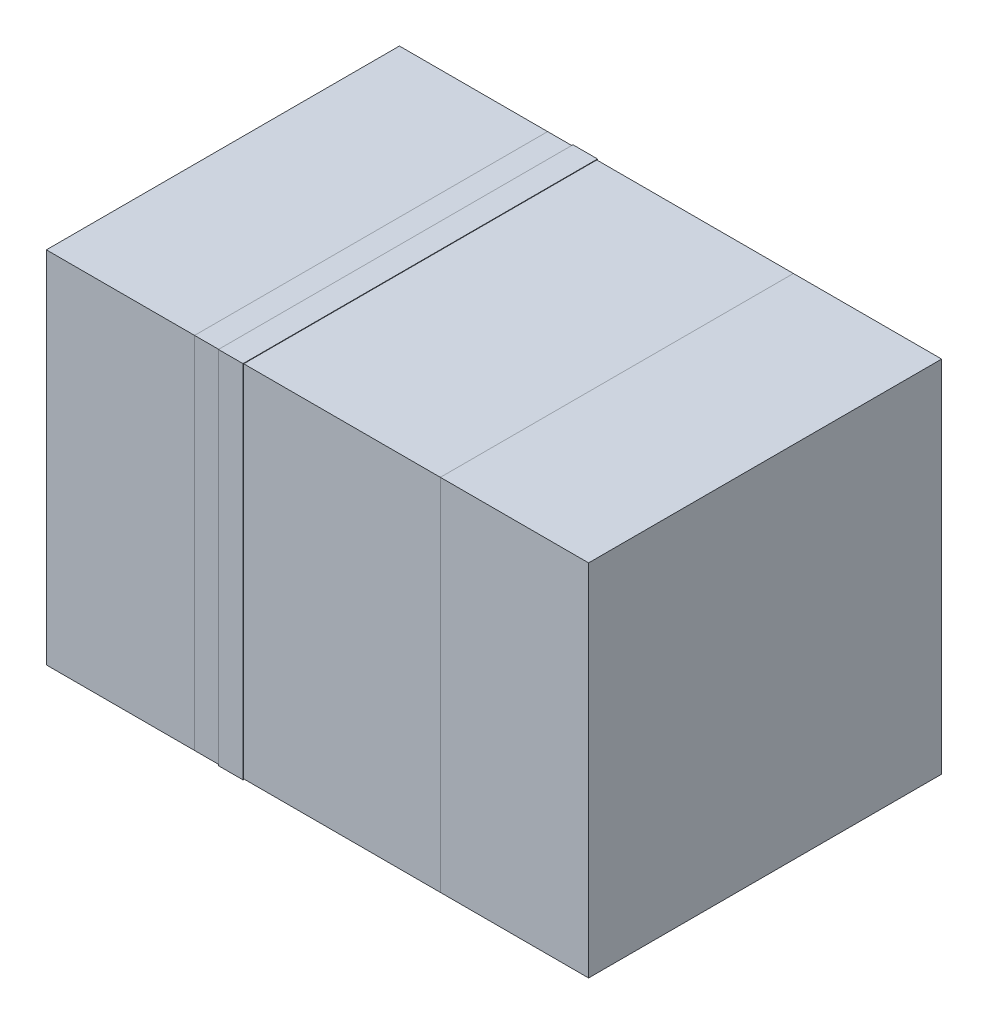
ISO-10303-21;
HEADER;
FILE_DESCRIPTION(('STEP AP214'),'2;1');
FILE_NAME('part.step','',(''),(''),'','','');
FILE_SCHEMA(('AUTOMOTIVE_DESIGN { 1 0 10303 214 1 1 1 1 }'));
ENDSEC;
DATA;
#1=APPLICATION_CONTEXT('core data for automotive mechanical design processes');
#2=APPLICATION_PROTOCOL_DEFINITION('international standard','automotive_design',2000,#1);
#3=PRODUCT_CONTEXT('',#1,'mechanical');
#4=PRODUCT('Part','Part','',(#3));
#5=PRODUCT_RELATED_PRODUCT_CATEGORY('part','',(#4));
#6=PRODUCT_DEFINITION_FORMATION('','',#4);
#7=PRODUCT_DEFINITION_CONTEXT('part definition',#1,'design');
#8=PRODUCT_DEFINITION('design','',#6,#7);
#9=PRODUCT_DEFINITION_SHAPE('','',#8);
#10=(LENGTH_UNIT() NAMED_UNIT(*) SI_UNIT(.MILLI.,.METRE.));
#11=(NAMED_UNIT(*) PLANE_ANGLE_UNIT() SI_UNIT($,.RADIAN.));
#12=(NAMED_UNIT(*) SI_UNIT($,.STERADIAN.) SOLID_ANGLE_UNIT());
#13=UNCERTAINTY_MEASURE_WITH_UNIT(LENGTH_MEASURE(1.E-05),#10,'distance_accuracy_value','');
#14=(GEOMETRIC_REPRESENTATION_CONTEXT(3) GLOBAL_UNCERTAINTY_ASSIGNED_CONTEXT((#13)) GLOBAL_UNIT_ASSIGNED_CONTEXT((#10,
#11,#12)) REPRESENTATION_CONTEXT('',''));
#15=CARTESIAN_POINT('',(0.,0.,0.));
#16=DIRECTION('',(0.,0.,1.));
#17=DIRECTION('',(1.,0.,0.));
#18=AXIS2_PLACEMENT_3D('',#15,#16,#17);
#19=CARTESIAN_POINT('',(-1.092,0.724,0.));
#20=DIRECTION('',(-1.,0.,0.));
#21=DIRECTION('',(0.,0.,1.));
#22=AXIS2_PLACEMENT_3D('',#19,#20,#21);
#23=PLANE('',#22);
#24=DIRECTION('',(0.,1.,0.));
#25=VECTOR('',#24,1.);
#26=CARTESIAN_POINT('',(-1.092,-0.724,1.422));
#27=LINE('',#26,#25);
#28=CARTESIAN_POINT('',(-1.092,0.724,1.422));
#29=VERTEX_POINT('',#28);
#30=CARTESIAN_POINT('',(-1.092,-0.724,1.422));
#31=VERTEX_POINT('',#30);
#32=EDGE_CURVE('P0_E67',#29,#31,#27,.F.);
#33=ORIENTED_EDGE('',*,*,#32,.F.);
#34=DIRECTION('',(0.,0.,1.));
#35=VECTOR('',#34,1.);
#36=CARTESIAN_POINT('',(-1.092,0.724,0.));
#37=LINE('',#36,#35);
#38=CARTESIAN_POINT('',(-1.092,0.724,0.));
#39=VERTEX_POINT('',#38);
#40=EDGE_CURVE('P0_E54',#39,#29,#37,.T.);
#41=ORIENTED_EDGE('',*,*,#40,.F.);
#42=DIRECTION('',(0.,1.,0.));
#43=VECTOR('',#42,1.);
#44=CARTESIAN_POINT('',(-1.092,0.724,0.));
#45=LINE('',#44,#43);
#46=CARTESIAN_POINT('',(-1.092,-0.724,0.));
#47=VERTEX_POINT('',#46);
#48=EDGE_CURVE('P0_E19',#47,#39,#45,.T.);
#49=ORIENTED_EDGE('',*,*,#48,.F.);
#50=DIRECTION('',(0.,0.,-1.));
#51=VECTOR('',#50,1.);
#52=CARTESIAN_POINT('',(-1.092,-0.724,0.));
#53=LINE('',#52,#51);
#54=EDGE_CURVE('P0_E80',#31,#47,#53,.T.);
#55=ORIENTED_EDGE('',*,*,#54,.F.);
#56=EDGE_LOOP('',(#33,#41,#49,#55));
#57=FACE_BOUND('',#56,.T.);
#58=ADVANCED_FACE('P0_F16',(#57),#23,.T.);
#59=CARTESIAN_POINT('',(-1.092,0.724,0.));
#60=DIRECTION('',(0.,0.,-1.));
#61=DIRECTION('',(-1.,0.,0.));
#62=AXIS2_PLACEMENT_3D('',#59,#60,#61);
#63=PLANE('',#62);
#64=DIRECTION('',(1.,0.,0.));
#65=VECTOR('',#64,1.);
#66=CARTESIAN_POINT('',(-1.092,-0.724,0.));
#67=LINE('',#66,#65);
#68=CARTESIAN_POINT('',(-0.495,-0.724,0.));
#69=VERTEX_POINT('',#68);
#70=EDGE_CURVE('P0_E63',#47,#69,#67,.T.);
#71=ORIENTED_EDGE('',*,*,#70,.F.);
#72=ORIENTED_EDGE('',*,*,#48,.T.);
#73=DIRECTION('',(1.,0.,0.));
#74=VECTOR('',#73,1.);
#75=CARTESIAN_POINT('',(-0.495,0.724,0.));
#76=LINE('',#75,#74);
#77=CARTESIAN_POINT('',(-0.495,0.724,0.));
#78=VERTEX_POINT('',#77);
#79=EDGE_CURVE('P0_E60',#78,#39,#76,.F.);
#80=ORIENTED_EDGE('',*,*,#79,.F.);
#81=DIRECTION('',(0.,1.,0.));
#82=VECTOR('',#81,1.);
#83=CARTESIAN_POINT('',(-0.495,-0.724,0.));
#84=LINE('',#83,#82);
#85=EDGE_CURVE('P0_E82',#69,#78,#84,.T.);
#86=ORIENTED_EDGE('',*,*,#85,.F.);
#87=EDGE_LOOP('',(#71,#72,#80,#86));
#88=FACE_BOUND('',#87,.T.);
#89=ADVANCED_FACE('P0_F59',(#88),#63,.T.);
#90=CARTESIAN_POINT('',(-0.495,0.724,0.));
#91=DIRECTION('',(0.,1.,0.));
#92=DIRECTION('',(0.,0.,1.));
#93=AXIS2_PLACEMENT_3D('',#90,#91,#92);
#94=PLANE('',#93);
#95=DIRECTION('',(1.,0.,0.));
#96=VECTOR('',#95,1.);
#97=CARTESIAN_POINT('',(-1.092,0.724,1.422));
#98=LINE('',#97,#96);
#99=CARTESIAN_POINT('',(-0.495,0.724,1.422));
#100=VERTEX_POINT('',#99);
#101=EDGE_CURVE('P0_E69',#100,#29,#98,.F.);
#102=ORIENTED_EDGE('',*,*,#101,.F.);
#103=DIRECTION('',(0.,0.,-1.));
#104=VECTOR('',#103,1.);
#105=CARTESIAN_POINT('',(-0.495,0.724,0.));
#106=LINE('',#105,#104);
#107=EDGE_CURVE('P0_E73',#78,#100,#106,.F.);
#108=ORIENTED_EDGE('',*,*,#107,.F.);
#109=ORIENTED_EDGE('',*,*,#79,.T.);
#110=ORIENTED_EDGE('',*,*,#40,.T.);
#111=EDGE_LOOP('',(#102,#108,#109,#110));
#112=FACE_BOUND('',#111,.T.);
#113=ADVANCED_FACE('P0_F71',(#112),#94,.T.);
#114=CARTESIAN_POINT('',(-1.092,-0.724,1.422));
#115=DIRECTION('',(0.,0.,1.));
#116=DIRECTION('',(1.,0.,0.));
#117=AXIS2_PLACEMENT_3D('',#114,#115,#116);
#118=PLANE('',#117);
#119=ORIENTED_EDGE('',*,*,#101,.T.);
#120=ORIENTED_EDGE('',*,*,#32,.T.);
#121=DIRECTION('',(1.,0.,0.));
#122=VECTOR('',#121,1.);
#123=CARTESIAN_POINT('',(-1.092,-0.724,1.422));
#124=LINE('',#123,#122);
#125=CARTESIAN_POINT('',(-0.495,-0.724,1.422));
#126=VERTEX_POINT('',#125);
#127=EDGE_CURVE('P0_E34',#126,#31,#124,.F.);
#128=ORIENTED_EDGE('',*,*,#127,.F.);
#129=DIRECTION('',(0.,1.,0.));
#130=VECTOR('',#129,1.);
#131=CARTESIAN_POINT('',(-0.495,-0.724,1.422));
#132=LINE('',#131,#130);
#133=EDGE_CURVE('P0_E25',#100,#126,#132,.F.);
#134=ORIENTED_EDGE('',*,*,#133,.F.);
#135=EDGE_LOOP('',(#119,#120,#128,#134));
#136=FACE_BOUND('',#135,.T.);
#137=ADVANCED_FACE('P0_F88',(#136),#118,.T.);
#138=CARTESIAN_POINT('',(-1.092,-0.724,0.));
#139=DIRECTION('',(0.,-1.,0.));
#140=DIRECTION('',(0.,0.,-1.));
#141=AXIS2_PLACEMENT_3D('',#138,#139,#140);
#142=PLANE('',#141);
#143=ORIENTED_EDGE('',*,*,#127,.T.);
#144=ORIENTED_EDGE('',*,*,#54,.T.);
#145=ORIENTED_EDGE('',*,*,#70,.T.);
#146=DIRECTION('',(0.,0.,-1.));
#147=VECTOR('',#146,1.);
#148=CARTESIAN_POINT('',(-0.495,-0.724,0.));
#149=LINE('',#148,#147);
#150=EDGE_CURVE('P0_E11',#126,#69,#149,.T.);
#151=ORIENTED_EDGE('',*,*,#150,.F.);
#152=EDGE_LOOP('',(#143,#144,#145,#151));
#153=FACE_BOUND('',#152,.T.);
#154=ADVANCED_FACE('P0_F90',(#153),#142,.T.);
#155=CARTESIAN_POINT('',(-0.495,-0.724,0.));
#156=DIRECTION('',(1.,0.,0.));
#157=DIRECTION('',(0.,0.,-1.));
#158=AXIS2_PLACEMENT_3D('',#155,#156,#157);
#159=PLANE('',#158);
#160=ORIENTED_EDGE('',*,*,#133,.T.);
#161=ORIENTED_EDGE('',*,*,#150,.T.);
#162=ORIENTED_EDGE('',*,*,#85,.T.);
#163=ORIENTED_EDGE('',*,*,#107,.T.);
#164=EDGE_LOOP('',(#160,#161,#162,#163));
#165=FACE_BOUND('',#164,.T.);
#166=ADVANCED_FACE('P0_F87',(#165),#159,.T.);
#167=CLOSED_SHELL('',(#58,#89,#113,#137,#154,#166));
#168=MANIFOLD_SOLID_BREP('P0_B1',#167);
#169=CARTESIAN_POINT('',(-0.396,-0.726,-0.003));
#170=DIRECTION('',(0.,-1.,0.));
#171=DIRECTION('',(0.,0.,-1.));
#172=AXIS2_PLACEMENT_3D('',#169,#170,#171);
#173=PLANE('',#172);
#174=DIRECTION('',(1.,0.,0.));
#175=VECTOR('',#174,1.);
#176=CARTESIAN_POINT('',(-0.396,-0.726,1.425));
#177=LINE('',#176,#175);
#178=CARTESIAN_POINT('',(-0.297,-0.726,1.425));
#179=VERTEX_POINT('',#178);
#180=CARTESIAN_POINT('',(-0.396,-0.726,1.425));
#181=VERTEX_POINT('',#180);
#182=EDGE_CURVE('P1_E95',#179,#181,#177,.F.);
#183=ORIENTED_EDGE('',*,*,#182,.T.);
#184=DIRECTION('',(0.,0.,1.));
#185=VECTOR('',#184,1.);
#186=CARTESIAN_POINT('',(-0.396,-0.726,0.));
#187=LINE('',#186,#185);
#188=CARTESIAN_POINT('',(-0.396,-0.726,-0.00299999999999999));
#189=VERTEX_POINT('',#188);
#190=EDGE_CURVE('P1_E94',#189,#181,#187,.T.);
#191=ORIENTED_EDGE('',*,*,#190,.F.);
#192=DIRECTION('',(1.,0.,0.));
#193=VECTOR('',#192,1.);
#194=CARTESIAN_POINT('',(-0.396,-0.726,-0.003));
#195=LINE('',#194,#193);
#196=CARTESIAN_POINT('',(-0.297,-0.726,-0.003));
#197=VERTEX_POINT('',#196);
#198=EDGE_CURVE('P1_E19',#189,#197,#195,.T.);
#199=ORIENTED_EDGE('',*,*,#198,.T.);
#200=DIRECTION('',(0.,0.,-1.));
#201=VECTOR('',#200,1.);
#202=CARTESIAN_POINT('',(-0.297,-0.726,-0.003));
#203=LINE('',#202,#201);
#204=EDGE_CURVE('P1_E91',#179,#197,#203,.T.);
#205=ORIENTED_EDGE('',*,*,#204,.F.);
#206=EDGE_LOOP('',(#183,#191,#199,#205));
#207=FACE_BOUND('',#206,.T.);
#208=ADVANCED_FACE('P1_F16',(#207),#173,.T.);
#209=CARTESIAN_POINT('',(-0.297,-0.724,1.422));
#210=DIRECTION('',(0.,0.,-1.));
#211=DIRECTION('',(-1.,0.,0.));
#212=AXIS2_PLACEMENT_3D('',#209,#210,#211);
#213=PLANE('',#212);
#214=DIRECTION('',(-1.,0.,0.));
#215=VECTOR('',#214,1.);
#216=CARTESIAN_POINT('',(-0.297,0.724,1.422));
#217=LINE('',#216,#215);
#218=CARTESIAN_POINT('',(-0.396,0.724,1.422));
#219=VERTEX_POINT('',#218);
#220=CARTESIAN_POINT('',(-0.297,0.724,1.422));
#221=VERTEX_POINT('',#220);
#222=EDGE_CURVE('P1_E77',#219,#221,#217,.F.);
#223=ORIENTED_EDGE('',*,*,#222,.T.);
#224=DIRECTION('',(0.,1.,0.));
#225=VECTOR('',#224,1.);
#226=CARTESIAN_POINT('',(-0.297,-0.726,1.422));
#227=LINE('',#226,#225);
#228=CARTESIAN_POINT('',(-0.297,-0.724,1.422));
#229=VERTEX_POINT('',#228);
#230=EDGE_CURVE('P1_E98',#229,#221,#227,.T.);
#231=ORIENTED_EDGE('',*,*,#230,.F.);
#232=DIRECTION('',(-1.,0.,0.));
#233=VECTOR('',#232,1.);
#234=CARTESIAN_POINT('',(-0.297,-0.724,1.422));
#235=LINE('',#234,#233);
#236=CARTESIAN_POINT('',(-0.396,-0.724,1.422));
#237=VERTEX_POINT('',#236);
#238=EDGE_CURVE('P1_E107',#229,#237,#235,.T.);
#239=ORIENTED_EDGE('',*,*,#238,.T.);
#240=DIRECTION('',(0.,1.,0.));
#241=VECTOR('',#240,1.);
#242=CARTESIAN_POINT('',(-0.396,-0.724,1.422));
#243=LINE('',#242,#241);
#244=EDGE_CURVE('P1_E100',#219,#237,#243,.F.);
#245=ORIENTED_EDGE('',*,*,#244,.F.);
#246=EDGE_LOOP('',(#223,#231,#239,#245));
#247=FACE_BOUND('',#246,.T.);
#248=ADVANCED_FACE('P1_F162',(#247),#213,.T.);
#249=CARTESIAN_POINT('',(-0.297,-0.724,0.));
#250=DIRECTION('',(0.,1.,0.));
#251=DIRECTION('',(0.,0.,1.));
#252=AXIS2_PLACEMENT_3D('',#249,#250,#251);
#253=PLANE('',#252);
#254=ORIENTED_EDGE('',*,*,#238,.F.);
#255=DIRECTION('',(0.,0.,1.));
#256=VECTOR('',#255,1.);
#257=CARTESIAN_POINT('',(-0.297,-0.724,0.));
#258=LINE('',#257,#256);
#259=CARTESIAN_POINT('',(-0.297,-0.724,0.));
#260=VERTEX_POINT('',#259);
#261=EDGE_CURVE('P1_E125',#229,#260,#258,.F.);
#262=ORIENTED_EDGE('',*,*,#261,.T.);
#263=DIRECTION('',(1.,0.,0.));
#264=VECTOR('',#263,1.);
#265=CARTESIAN_POINT('',(-0.396,-0.724,0.));
#266=LINE('',#265,#264);
#267=CARTESIAN_POINT('',(-0.396,-0.724,0.));
#268=VERTEX_POINT('',#267);
#269=EDGE_CURVE('P1_E120',#268,#260,#266,.T.);
#270=ORIENTED_EDGE('',*,*,#269,.F.);
#271=DIRECTION('',(0.,0.,1.));
#272=VECTOR('',#271,1.);
#273=CARTESIAN_POINT('',(-0.396,-0.724,0.));
#274=LINE('',#273,#272);
#275=EDGE_CURVE('P1_E130',#268,#237,#274,.T.);
#276=ORIENTED_EDGE('',*,*,#275,.T.);
#277=EDGE_LOOP('',(#254,#262,#270,#276));
#278=FACE_BOUND('',#277,.T.);
#279=ADVANCED_FACE('P1_F139',(#278),#253,.T.);
#280=CARTESIAN_POINT('',(-0.396,-0.726,1.425));
#281=DIRECTION('',(0.,0.,1.));
#282=DIRECTION('',(1.,0.,0.));
#283=AXIS2_PLACEMENT_3D('',#280,#281,#282);
#284=PLANE('',#283);
#285=DIRECTION('',(1.,0.,0.));
#286=VECTOR('',#285,1.);
#287=CARTESIAN_POINT('',(-0.297,0.726,1.425));
#288=LINE('',#287,#286);
#289=CARTESIAN_POINT('',(-0.396,0.726,1.425));
#290=VERTEX_POINT('',#289);
#291=CARTESIAN_POINT('',(-0.297,0.726,1.425));
#292=VERTEX_POINT('',#291);
#293=EDGE_CURVE('P1_E118',#290,#292,#288,.T.);
#294=ORIENTED_EDGE('',*,*,#293,.F.);
#295=DIRECTION('',(0.,1.,0.));
#296=VECTOR('',#295,1.);
#297=CARTESIAN_POINT('',(-0.396,-0.726,1.425));
#298=LINE('',#297,#296);
#299=EDGE_CURVE('P1_E114',#290,#181,#298,.F.);
#300=ORIENTED_EDGE('',*,*,#299,.T.);
#301=ORIENTED_EDGE('',*,*,#182,.F.);
#302=DIRECTION('',(0.,1.,0.));
#303=VECTOR('',#302,1.);
#304=CARTESIAN_POINT('',(-0.297,-0.726,1.425));
#305=LINE('',#304,#303);
#306=EDGE_CURVE('P1_E97',#179,#292,#305,.T.);
#307=ORIENTED_EDGE('',*,*,#306,.T.);
#308=EDGE_LOOP('',(#294,#300,#301,#307));
#309=FACE_BOUND('',#308,.T.);
#310=ADVANCED_FACE('P1_F116',(#309),#284,.T.);
#311=CARTESIAN_POINT('',(-0.396,-0.724,0.));
#312=DIRECTION('',(0.,0.,1.));
#313=DIRECTION('',(1.,0.,0.));
#314=AXIS2_PLACEMENT_3D('',#311,#312,#313);
#315=PLANE('',#314);
#316=DIRECTION('',(1.,0.,0.));
#317=VECTOR('',#316,1.);
#318=CARTESIAN_POINT('',(-0.396,0.724,0.));
#319=LINE('',#318,#317);
#320=CARTESIAN_POINT('',(-0.396,0.724,0.));
#321=VERTEX_POINT('',#320);
#322=CARTESIAN_POINT('',(-0.297,0.724,0.));
#323=VERTEX_POINT('',#322);
#324=EDGE_CURVE('P1_E123',#321,#323,#319,.T.);
#325=ORIENTED_EDGE('',*,*,#324,.F.);
#326=DIRECTION('',(0.,1.,0.));
#327=VECTOR('',#326,1.);
#328=CARTESIAN_POINT('',(-0.396,0.726,0.));
#329=LINE('',#328,#327);
#330=EDGE_CURVE('P1_E145',#268,#321,#329,.T.);
#331=ORIENTED_EDGE('',*,*,#330,.F.);
#332=ORIENTED_EDGE('',*,*,#269,.T.);
#333=DIRECTION('',(0.,1.,0.));
#334=VECTOR('',#333,1.);
#335=CARTESIAN_POINT('',(-0.297,-0.726,0.));
#336=LINE('',#335,#334);
#337=EDGE_CURVE('P1_E147',#323,#260,#336,.F.);
#338=ORIENTED_EDGE('',*,*,#337,.F.);
#339=EDGE_LOOP('',(#325,#331,#332,#338));
#340=FACE_BOUND('',#339,.T.);
#341=ADVANCED_FACE('P1_F146',(#340),#315,.T.);
#342=CARTESIAN_POINT('',(-0.396,0.724,0.));
#343=DIRECTION('',(0.,-1.,0.));
#344=DIRECTION('',(0.,0.,-1.));
#345=AXIS2_PLACEMENT_3D('',#342,#343,#344);
#346=PLANE('',#345);
#347=ORIENTED_EDGE('',*,*,#222,.F.);
#348=DIRECTION('',(0.,0.,1.));
#349=VECTOR('',#348,1.);
#350=CARTESIAN_POINT('',(-0.396,0.724,-0.003));
#351=LINE('',#350,#349);
#352=EDGE_CURVE('P1_E137',#321,#219,#351,.T.);
#353=ORIENTED_EDGE('',*,*,#352,.F.);
#354=ORIENTED_EDGE('',*,*,#324,.T.);
#355=DIRECTION('',(0.,0.,-1.));
#356=VECTOR('',#355,1.);
#357=CARTESIAN_POINT('',(-0.297,0.724,-0.003));
#358=LINE('',#357,#356);
#359=EDGE_CURVE('P1_E150',#221,#323,#358,.T.);
#360=ORIENTED_EDGE('',*,*,#359,.F.);
#361=EDGE_LOOP('',(#347,#353,#354,#360));
#362=FACE_BOUND('',#361,.T.);
#363=ADVANCED_FACE('P1_F160',(#362),#346,.T.);
#364=CARTESIAN_POINT('',(-0.297,0.726,-0.003));
#365=DIRECTION('',(0.,1.,0.));
#366=DIRECTION('',(0.,0.,1.));
#367=AXIS2_PLACEMENT_3D('',#364,#365,#366);
#368=PLANE('',#367);
#369=ORIENTED_EDGE('',*,*,#293,.T.);
#370=DIRECTION('',(0.,0.,-1.));
#371=VECTOR('',#370,1.);
#372=CARTESIAN_POINT('',(-0.297,0.726,-0.003));
#373=LINE('',#372,#371);
#374=CARTESIAN_POINT('',(-0.297,0.726,-0.003));
#375=VERTEX_POINT('',#374);
#376=EDGE_CURVE('P1_E156',#375,#292,#373,.F.);
#377=ORIENTED_EDGE('',*,*,#376,.F.);
#378=DIRECTION('',(1.,0.,0.));
#379=VECTOR('',#378,1.);
#380=CARTESIAN_POINT('',(-0.297,0.726,-0.003));
#381=LINE('',#380,#379);
#382=CARTESIAN_POINT('',(-0.396,0.726,-0.003));
#383=VERTEX_POINT('',#382);
#384=EDGE_CURVE('P1_E33',#375,#383,#381,.F.);
#385=ORIENTED_EDGE('',*,*,#384,.T.);
#386=DIRECTION('',(0.,0.,1.));
#387=VECTOR('',#386,1.);
#388=CARTESIAN_POINT('',(-0.396,0.726,-0.003));
#389=LINE('',#388,#387);
#390=EDGE_CURVE('P1_E86',#290,#383,#389,.F.);
#391=ORIENTED_EDGE('',*,*,#390,.F.);
#392=EDGE_LOOP('',(#369,#377,#385,#391));
#393=FACE_BOUND('',#392,.T.);
#394=ADVANCED_FACE('P1_F179',(#393),#368,.T.);
#395=CARTESIAN_POINT('',(-0.297,-0.726,-0.003));
#396=DIRECTION('',(1.,0.,0.));
#397=DIRECTION('',(0.,0.,-1.));
#398=AXIS2_PLACEMENT_3D('',#395,#396,#397);
#399=PLANE('',#398);
#400=ORIENTED_EDGE('',*,*,#337,.T.);
#401=ORIENTED_EDGE('',*,*,#261,.F.);
#402=ORIENTED_EDGE('',*,*,#230,.T.);
#403=ORIENTED_EDGE('',*,*,#359,.T.);
#404=EDGE_LOOP('',(#400,#401,#402,#403));
#405=FACE_BOUND('',#404,.T.);
#406=ORIENTED_EDGE('',*,*,#204,.T.);
#407=DIRECTION('',(0.,1.,0.));
#408=VECTOR('',#407,1.);
#409=CARTESIAN_POINT('',(-0.297,0.726,-0.003));
#410=LINE('',#409,#408);
#411=EDGE_CURVE('P1_E25',#375,#197,#410,.F.);
#412=ORIENTED_EDGE('',*,*,#411,.F.);
#413=ORIENTED_EDGE('',*,*,#376,.T.);
#414=ORIENTED_EDGE('',*,*,#306,.F.);
#415=EDGE_LOOP('',(#406,#412,#413,#414));
#416=FACE_BOUND('',#415,.T.);
#417=ADVANCED_FACE('P1_F96',(#405,#416),#399,.T.);
#418=CARTESIAN_POINT('',(-0.396,0.726,-0.003));
#419=DIRECTION('',(-1.,0.,0.));
#420=DIRECTION('',(0.,0.,1.));
#421=AXIS2_PLACEMENT_3D('',#418,#419,#420);
#422=PLANE('',#421);
#423=DIRECTION('',(0.,1.,0.));
#424=VECTOR('',#423,1.);
#425=CARTESIAN_POINT('',(-0.396,0.726,-0.003));
#426=LINE('',#425,#424);
#427=EDGE_CURVE('P1_E11',#189,#383,#426,.T.);
#428=ORIENTED_EDGE('',*,*,#427,.F.);
#429=ORIENTED_EDGE('',*,*,#190,.T.);
#430=ORIENTED_EDGE('',*,*,#299,.F.);
#431=ORIENTED_EDGE('',*,*,#390,.T.);
#432=EDGE_LOOP('',(#428,#429,#430,#431));
#433=FACE_BOUND('',#432,.T.);
#434=ORIENTED_EDGE('',*,*,#352,.T.);
#435=ORIENTED_EDGE('',*,*,#244,.T.);
#436=ORIENTED_EDGE('',*,*,#275,.F.);
#437=ORIENTED_EDGE('',*,*,#330,.T.);
#438=EDGE_LOOP('',(#434,#435,#436,#437));
#439=FACE_BOUND('',#438,.T.);
#440=ADVANCED_FACE('P1_F111',(#433,#439),#422,.T.);
#441=CARTESIAN_POINT('',(-0.396,0.726,-0.003));
#442=DIRECTION('',(0.,0.,-1.));
#443=DIRECTION('',(-1.,0.,0.));
#444=AXIS2_PLACEMENT_3D('',#441,#442,#443);
#445=PLANE('',#444);
#446=ORIENTED_EDGE('',*,*,#198,.F.);
#447=ORIENTED_EDGE('',*,*,#427,.T.);
#448=ORIENTED_EDGE('',*,*,#384,.F.);
#449=ORIENTED_EDGE('',*,*,#411,.T.);
#450=EDGE_LOOP('',(#446,#447,#448,#449));
#451=FACE_BOUND('',#450,.T.);
#452=ADVANCED_FACE('P1_F81',(#451),#445,.T.);
#453=CLOSED_SHELL('',(#208,#248,#279,#310,#341,#363,#394,#417,#440,#452));
#454=MANIFOLD_SOLID_BREP('P1_B1',#453);
#455=CARTESIAN_POINT('',(-0.495,0.724,0.));
#456=DIRECTION('',(-1.,0.,0.));
#457=DIRECTION('',(0.,0.,1.));
#458=AXIS2_PLACEMENT_3D('',#455,#456,#457);
#459=PLANE('',#458);
#460=DIRECTION('',(0.,1.,0.));
#461=VECTOR('',#460,1.);
#462=CARTESIAN_POINT('',(-0.495,-0.724,1.422));
#463=LINE('',#462,#461);
#464=CARTESIAN_POINT('',(-0.495,0.724,1.422));
#465=VERTEX_POINT('',#464);
#466=CARTESIAN_POINT('',(-0.495,-0.724,1.422));
#467=VERTEX_POINT('',#466);
#468=EDGE_CURVE('P2_E67',#465,#467,#463,.F.);
#469=ORIENTED_EDGE('',*,*,#468,.F.);
#470=DIRECTION('',(0.,0.,1.));
#471=VECTOR('',#470,1.);
#472=CARTESIAN_POINT('',(-0.495,0.724,0.));
#473=LINE('',#472,#471);
#474=CARTESIAN_POINT('',(-0.495,0.724,0.));
#475=VERTEX_POINT('',#474);
#476=EDGE_CURVE('P2_E54',#475,#465,#473,.T.);
#477=ORIENTED_EDGE('',*,*,#476,.F.);
#478=DIRECTION('',(0.,1.,0.));
#479=VECTOR('',#478,1.);
#480=CARTESIAN_POINT('',(-0.495,0.724,0.));
#481=LINE('',#480,#479);
#482=CARTESIAN_POINT('',(-0.495,-0.724,0.));
#483=VERTEX_POINT('',#482);
#484=EDGE_CURVE('P2_E19',#483,#475,#481,.T.);
#485=ORIENTED_EDGE('',*,*,#484,.F.);
#486=DIRECTION('',(0.,0.,-1.));
#487=VECTOR('',#486,1.);
#488=CARTESIAN_POINT('',(-0.495,-0.724,0.));
#489=LINE('',#488,#487);
#490=EDGE_CURVE('P2_E80',#467,#483,#489,.T.);
#491=ORIENTED_EDGE('',*,*,#490,.F.);
#492=EDGE_LOOP('',(#469,#477,#485,#491));
#493=FACE_BOUND('',#492,.T.);
#494=ADVANCED_FACE('P2_F16',(#493),#459,.T.);
#495=CARTESIAN_POINT('',(-0.495,0.724,0.));
#496=DIRECTION('',(0.,0.,-1.));
#497=DIRECTION('',(-1.,0.,0.));
#498=AXIS2_PLACEMENT_3D('',#495,#496,#497);
#499=PLANE('',#498);
#500=DIRECTION('',(1.,0.,0.));
#501=VECTOR('',#500,1.);
#502=CARTESIAN_POINT('',(-0.495,-0.724,0.));
#503=LINE('',#502,#501);
#504=CARTESIAN_POINT('',(0.495,-0.724,0.));
#505=VERTEX_POINT('',#504);
#506=EDGE_CURVE('P2_E63',#483,#505,#503,.T.);
#507=ORIENTED_EDGE('',*,*,#506,.F.);
#508=ORIENTED_EDGE('',*,*,#484,.T.);
#509=DIRECTION('',(1.,0.,0.));
#510=VECTOR('',#509,1.);
#511=CARTESIAN_POINT('',(0.495,0.724,0.));
#512=LINE('',#511,#510);
#513=CARTESIAN_POINT('',(0.495,0.724,0.));
#514=VERTEX_POINT('',#513);
#515=EDGE_CURVE('P2_E60',#514,#475,#512,.F.);
#516=ORIENTED_EDGE('',*,*,#515,.F.);
#517=DIRECTION('',(0.,1.,0.));
#518=VECTOR('',#517,1.);
#519=CARTESIAN_POINT('',(0.495,-0.724,0.));
#520=LINE('',#519,#518);
#521=EDGE_CURVE('P2_E82',#505,#514,#520,.T.);
#522=ORIENTED_EDGE('',*,*,#521,.F.);
#523=EDGE_LOOP('',(#507,#508,#516,#522));
#524=FACE_BOUND('',#523,.T.);
#525=ADVANCED_FACE('P2_F59',(#524),#499,.T.);
#526=CARTESIAN_POINT('',(0.495,0.724,0.));
#527=DIRECTION('',(0.,1.,0.));
#528=DIRECTION('',(0.,0.,1.));
#529=AXIS2_PLACEMENT_3D('',#526,#527,#528);
#530=PLANE('',#529);
#531=DIRECTION('',(1.,0.,0.));
#532=VECTOR('',#531,1.);
#533=CARTESIAN_POINT('',(-0.495,0.724,1.422));
#534=LINE('',#533,#532);
#535=CARTESIAN_POINT('',(0.495,0.724,1.422));
#536=VERTEX_POINT('',#535);
#537=EDGE_CURVE('P2_E69',#536,#465,#534,.F.);
#538=ORIENTED_EDGE('',*,*,#537,.F.);
#539=DIRECTION('',(0.,0.,-1.));
#540=VECTOR('',#539,1.);
#541=CARTESIAN_POINT('',(0.495,0.724,0.));
#542=LINE('',#541,#540);
#543=EDGE_CURVE('P2_E73',#514,#536,#542,.F.);
#544=ORIENTED_EDGE('',*,*,#543,.F.);
#545=ORIENTED_EDGE('',*,*,#515,.T.);
#546=ORIENTED_EDGE('',*,*,#476,.T.);
#547=EDGE_LOOP('',(#538,#544,#545,#546));
#548=FACE_BOUND('',#547,.T.);
#549=ADVANCED_FACE('P2_F71',(#548),#530,.T.);
#550=CARTESIAN_POINT('',(-0.495,-0.724,1.422));
#551=DIRECTION('',(0.,0.,1.));
#552=DIRECTION('',(1.,0.,0.));
#553=AXIS2_PLACEMENT_3D('',#550,#551,#552);
#554=PLANE('',#553);
#555=ORIENTED_EDGE('',*,*,#537,.T.);
#556=ORIENTED_EDGE('',*,*,#468,.T.);
#557=DIRECTION('',(1.,0.,0.));
#558=VECTOR('',#557,1.);
#559=CARTESIAN_POINT('',(-0.495,-0.724,1.422));
#560=LINE('',#559,#558);
#561=CARTESIAN_POINT('',(0.495,-0.724,1.422));
#562=VERTEX_POINT('',#561);
#563=EDGE_CURVE('P2_E34',#562,#467,#560,.F.);
#564=ORIENTED_EDGE('',*,*,#563,.F.);
#565=DIRECTION('',(0.,1.,0.));
#566=VECTOR('',#565,1.);
#567=CARTESIAN_POINT('',(0.495,-0.724,1.422));
#568=LINE('',#567,#566);
#569=EDGE_CURVE('P2_E25',#536,#562,#568,.F.);
#570=ORIENTED_EDGE('',*,*,#569,.F.);
#571=EDGE_LOOP('',(#555,#556,#564,#570));
#572=FACE_BOUND('',#571,.T.);
#573=ADVANCED_FACE('P2_F88',(#572),#554,.T.);
#574=CARTESIAN_POINT('',(-0.495,-0.724,0.));
#575=DIRECTION('',(0.,-1.,0.));
#576=DIRECTION('',(0.,0.,-1.));
#577=AXIS2_PLACEMENT_3D('',#574,#575,#576);
#578=PLANE('',#577);
#579=ORIENTED_EDGE('',*,*,#563,.T.);
#580=ORIENTED_EDGE('',*,*,#490,.T.);
#581=ORIENTED_EDGE('',*,*,#506,.T.);
#582=DIRECTION('',(0.,0.,-1.));
#583=VECTOR('',#582,1.);
#584=CARTESIAN_POINT('',(0.495,-0.724,0.));
#585=LINE('',#584,#583);
#586=EDGE_CURVE('P2_E11',#562,#505,#585,.T.);
#587=ORIENTED_EDGE('',*,*,#586,.F.);
#588=EDGE_LOOP('',(#579,#580,#581,#587));
#589=FACE_BOUND('',#588,.T.);
#590=ADVANCED_FACE('P2_F90',(#589),#578,.T.);
#591=CARTESIAN_POINT('',(0.495,-0.724,0.));
#592=DIRECTION('',(1.,0.,0.));
#593=DIRECTION('',(0.,0.,-1.));
#594=AXIS2_PLACEMENT_3D('',#591,#592,#593);
#595=PLANE('',#594);
#596=ORIENTED_EDGE('',*,*,#569,.T.);
#597=ORIENTED_EDGE('',*,*,#586,.T.);
#598=ORIENTED_EDGE('',*,*,#521,.T.);
#599=ORIENTED_EDGE('',*,*,#543,.T.);
#600=EDGE_LOOP('',(#596,#597,#598,#599));
#601=FACE_BOUND('',#600,.T.);
#602=ADVANCED_FACE('P2_F87',(#601),#595,.T.);
#603=CLOSED_SHELL('',(#494,#525,#549,#573,#590,#602));
#604=MANIFOLD_SOLID_BREP('P2_B1',#603);
#605=CARTESIAN_POINT('',(0.495,0.724,0.));
#606=DIRECTION('',(-1.,0.,0.));
#607=DIRECTION('',(0.,0.,1.));
#608=AXIS2_PLACEMENT_3D('',#605,#606,#607);
#609=PLANE('',#608);
#610=DIRECTION('',(0.,1.,0.));
#611=VECTOR('',#610,1.);
#612=CARTESIAN_POINT('',(0.495,-0.724,1.422));
#613=LINE('',#612,#611);
#614=CARTESIAN_POINT('',(0.495,0.724,1.422));
#615=VERTEX_POINT('',#614);
#616=CARTESIAN_POINT('',(0.495,-0.724,1.422));
#617=VERTEX_POINT('',#616);
#618=EDGE_CURVE('P3_E67',#615,#617,#613,.F.);
#619=ORIENTED_EDGE('',*,*,#618,.F.);
#620=DIRECTION('',(0.,0.,1.));
#621=VECTOR('',#620,1.);
#622=CARTESIAN_POINT('',(0.495,0.724,0.));
#623=LINE('',#622,#621);
#624=CARTESIAN_POINT('',(0.495,0.724,0.));
#625=VERTEX_POINT('',#624);
#626=EDGE_CURVE('P3_E54',#625,#615,#623,.T.);
#627=ORIENTED_EDGE('',*,*,#626,.F.);
#628=DIRECTION('',(0.,1.,0.));
#629=VECTOR('',#628,1.);
#630=CARTESIAN_POINT('',(0.495,0.724,0.));
#631=LINE('',#630,#629);
#632=CARTESIAN_POINT('',(0.495,-0.724,0.));
#633=VERTEX_POINT('',#632);
#634=EDGE_CURVE('P3_E19',#633,#625,#631,.T.);
#635=ORIENTED_EDGE('',*,*,#634,.F.);
#636=DIRECTION('',(0.,0.,-1.));
#637=VECTOR('',#636,1.);
#638=CARTESIAN_POINT('',(0.495,-0.724,0.));
#639=LINE('',#638,#637);
#640=EDGE_CURVE('P3_E80',#617,#633,#639,.T.);
#641=ORIENTED_EDGE('',*,*,#640,.F.);
#642=EDGE_LOOP('',(#619,#627,#635,#641));
#643=FACE_BOUND('',#642,.T.);
#644=ADVANCED_FACE('P3_F16',(#643),#609,.T.);
#645=CARTESIAN_POINT('',(0.495,0.724,0.));
#646=DIRECTION('',(0.,0.,-1.));
#647=DIRECTION('',(-1.,0.,0.));
#648=AXIS2_PLACEMENT_3D('',#645,#646,#647);
#649=PLANE('',#648);
#650=DIRECTION('',(1.,0.,0.));
#651=VECTOR('',#650,1.);
#652=CARTESIAN_POINT('',(0.495,-0.724,0.));
#653=LINE('',#652,#651);
#654=CARTESIAN_POINT('',(1.092,-0.724,0.));
#655=VERTEX_POINT('',#654);
#656=EDGE_CURVE('P3_E63',#633,#655,#653,.T.);
#657=ORIENTED_EDGE('',*,*,#656,.F.);
#658=ORIENTED_EDGE('',*,*,#634,.T.);
#659=DIRECTION('',(1.,0.,0.));
#660=VECTOR('',#659,1.);
#661=CARTESIAN_POINT('',(1.092,0.724,0.));
#662=LINE('',#661,#660);
#663=CARTESIAN_POINT('',(1.092,0.724,0.));
#664=VERTEX_POINT('',#663);
#665=EDGE_CURVE('P3_E60',#664,#625,#662,.F.);
#666=ORIENTED_EDGE('',*,*,#665,.F.);
#667=DIRECTION('',(0.,1.,0.));
#668=VECTOR('',#667,1.);
#669=CARTESIAN_POINT('',(1.092,-0.724,0.));
#670=LINE('',#669,#668);
#671=EDGE_CURVE('P3_E82',#655,#664,#670,.T.);
#672=ORIENTED_EDGE('',*,*,#671,.F.);
#673=EDGE_LOOP('',(#657,#658,#666,#672));
#674=FACE_BOUND('',#673,.T.);
#675=ADVANCED_FACE('P3_F59',(#674),#649,.T.);
#676=CARTESIAN_POINT('',(1.092,0.724,0.));
#677=DIRECTION('',(0.,1.,0.));
#678=DIRECTION('',(0.,0.,1.));
#679=AXIS2_PLACEMENT_3D('',#676,#677,#678);
#680=PLANE('',#679);
#681=DIRECTION('',(1.,0.,0.));
#682=VECTOR('',#681,1.);
#683=CARTESIAN_POINT('',(0.495,0.724,1.422));
#684=LINE('',#683,#682);
#685=CARTESIAN_POINT('',(1.092,0.724,1.422));
#686=VERTEX_POINT('',#685);
#687=EDGE_CURVE('P3_E69',#686,#615,#684,.F.);
#688=ORIENTED_EDGE('',*,*,#687,.F.);
#689=DIRECTION('',(0.,0.,-1.));
#690=VECTOR('',#689,1.);
#691=CARTESIAN_POINT('',(1.092,0.724,0.));
#692=LINE('',#691,#690);
#693=EDGE_CURVE('P3_E73',#664,#686,#692,.F.);
#694=ORIENTED_EDGE('',*,*,#693,.F.);
#695=ORIENTED_EDGE('',*,*,#665,.T.);
#696=ORIENTED_EDGE('',*,*,#626,.T.);
#697=EDGE_LOOP('',(#688,#694,#695,#696));
#698=FACE_BOUND('',#697,.T.);
#699=ADVANCED_FACE('P3_F71',(#698),#680,.T.);
#700=CARTESIAN_POINT('',(0.495,-0.724,1.422));
#701=DIRECTION('',(0.,0.,1.));
#702=DIRECTION('',(1.,0.,0.));
#703=AXIS2_PLACEMENT_3D('',#700,#701,#702);
#704=PLANE('',#703);
#705=ORIENTED_EDGE('',*,*,#687,.T.);
#706=ORIENTED_EDGE('',*,*,#618,.T.);
#707=DIRECTION('',(1.,0.,0.));
#708=VECTOR('',#707,1.);
#709=CARTESIAN_POINT('',(0.495,-0.724,1.422));
#710=LINE('',#709,#708);
#711=CARTESIAN_POINT('',(1.092,-0.724,1.422));
#712=VERTEX_POINT('',#711);
#713=EDGE_CURVE('P3_E34',#712,#617,#710,.F.);
#714=ORIENTED_EDGE('',*,*,#713,.F.);
#715=DIRECTION('',(0.,1.,0.));
#716=VECTOR('',#715,1.);
#717=CARTESIAN_POINT('',(1.092,-0.724,1.422));
#718=LINE('',#717,#716);
#719=EDGE_CURVE('P3_E25',#686,#712,#718,.F.);
#720=ORIENTED_EDGE('',*,*,#719,.F.);
#721=EDGE_LOOP('',(#705,#706,#714,#720));
#722=FACE_BOUND('',#721,.T.);
#723=ADVANCED_FACE('P3_F88',(#722),#704,.T.);
#724=CARTESIAN_POINT('',(0.495,-0.724,0.));
#725=DIRECTION('',(0.,-1.,0.));
#726=DIRECTION('',(0.,0.,-1.));
#727=AXIS2_PLACEMENT_3D('',#724,#725,#726);
#728=PLANE('',#727);
#729=ORIENTED_EDGE('',*,*,#713,.T.);
#730=ORIENTED_EDGE('',*,*,#640,.T.);
#731=ORIENTED_EDGE('',*,*,#656,.T.);
#732=DIRECTION('',(0.,0.,-1.));
#733=VECTOR('',#732,1.);
#734=CARTESIAN_POINT('',(1.092,-0.724,0.));
#735=LINE('',#734,#733);
#736=EDGE_CURVE('P3_E11',#712,#655,#735,.T.);
#737=ORIENTED_EDGE('',*,*,#736,.F.);
#738=EDGE_LOOP('',(#729,#730,#731,#737));
#739=FACE_BOUND('',#738,.T.);
#740=ADVANCED_FACE('P3_F90',(#739),#728,.T.);
#741=CARTESIAN_POINT('',(1.092,-0.724,0.));
#742=DIRECTION('',(1.,0.,0.));
#743=DIRECTION('',(0.,0.,-1.));
#744=AXIS2_PLACEMENT_3D('',#741,#742,#743);
#745=PLANE('',#744);
#746=ORIENTED_EDGE('',*,*,#719,.T.);
#747=ORIENTED_EDGE('',*,*,#736,.T.);
#748=ORIENTED_EDGE('',*,*,#671,.T.);
#749=ORIENTED_EDGE('',*,*,#693,.T.);
#750=EDGE_LOOP('',(#746,#747,#748,#749));
#751=FACE_BOUND('',#750,.T.);
#752=ADVANCED_FACE('P3_F87',(#751),#745,.T.);
#753=CLOSED_SHELL('',(#644,#675,#699,#723,#740,#752));
#754=MANIFOLD_SOLID_BREP('P3_B1',#753);
#755=ADVANCED_BREP_SHAPE_REPRESENTATION('',(#18,#168,#454,#604,#754),#14);
#756=SHAPE_DEFINITION_REPRESENTATION(#9,#755);
ENDSEC;
END-ISO-10303-21;
